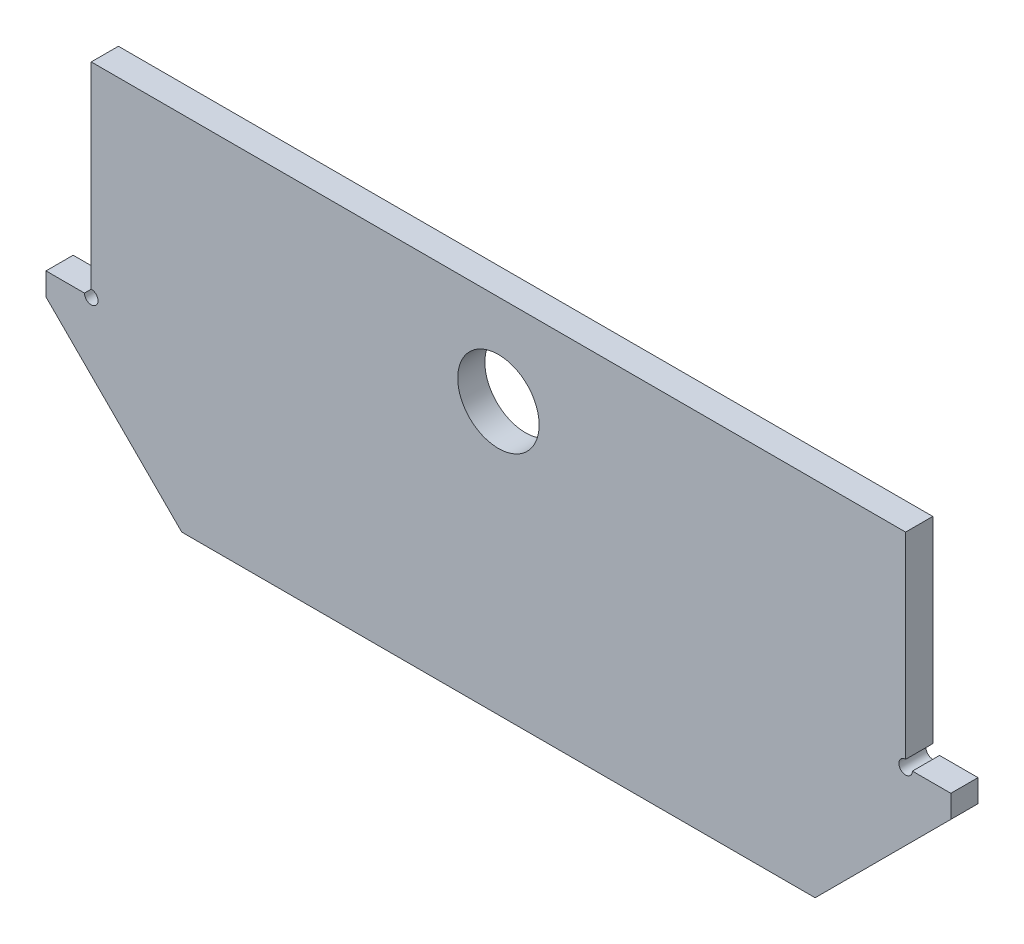
ISO-10303-21;
HEADER;
FILE_DESCRIPTION(('STEP AP214'),'2;1');
FILE_NAME('part.step','',(''),(''),'','','');
FILE_SCHEMA(('AUTOMOTIVE_DESIGN { 1 0 10303 214 1 1 1 1 }'));
ENDSEC;
DATA;
#1=APPLICATION_CONTEXT('core data for automotive mechanical design processes');
#2=APPLICATION_PROTOCOL_DEFINITION('international standard','automotive_design',2000,#1);
#3=PRODUCT_CONTEXT('',#1,'mechanical');
#4=PRODUCT('Part','Part','',(#3));
#5=PRODUCT_RELATED_PRODUCT_CATEGORY('part','',(#4));
#6=PRODUCT_DEFINITION_FORMATION('','',#4);
#7=PRODUCT_DEFINITION_CONTEXT('part definition',#1,'design');
#8=PRODUCT_DEFINITION('design','',#6,#7);
#9=PRODUCT_DEFINITION_SHAPE('','',#8);
#10=(LENGTH_UNIT() NAMED_UNIT(*) SI_UNIT(.MILLI.,.METRE.));
#11=(NAMED_UNIT(*) PLANE_ANGLE_UNIT() SI_UNIT($,.RADIAN.));
#12=(NAMED_UNIT(*) SI_UNIT($,.STERADIAN.) SOLID_ANGLE_UNIT());
#13=UNCERTAINTY_MEASURE_WITH_UNIT(LENGTH_MEASURE(1.E-05),#10,'distance_accuracy_value','');
#14=(GEOMETRIC_REPRESENTATION_CONTEXT(3) GLOBAL_UNCERTAINTY_ASSIGNED_CONTEXT((#13)) GLOBAL_UNIT_ASSIGNED_CONTEXT((#10,
#11,#12)) REPRESENTATION_CONTEXT('',''));
#15=CARTESIAN_POINT('',(0.,0.,0.));
#16=DIRECTION('',(0.,0.,1.));
#17=DIRECTION('',(1.,0.,0.));
#18=AXIS2_PLACEMENT_3D('',#15,#16,#17);
#19=CARTESIAN_POINT('',(-99.9999999999998,-1414.,-3.));
#20=DIRECTION('',(0.,1.,0.));
#21=DIRECTION('',(0.,0.,1.));
#22=AXIS2_PLACEMENT_3D('',#19,#20,#21);
#23=PLANE('',#22);
#24=DIRECTION('',(0.,0.,1.));
#25=VECTOR('',#24,1.);
#26=CARTESIAN_POINT('',(-91.4999999999998,-1414.,-3.));
#27=LINE('',#26,#25);
#28=CARTESIAN_POINT('',(-91.4999999999998,-1414.,-3.));
#29=VERTEX_POINT('',#28);
#30=CARTESIAN_POINT('',(-91.4999999999998,-1414.,3.));
#31=VERTEX_POINT('',#30);
#32=EDGE_CURVE('E58',#29,#31,#27,.T.);
#33=ORIENTED_EDGE('',*,*,#32,.F.);
#34=DIRECTION('',(-1.,0.,0.));
#35=VECTOR('',#34,1.);
#36=CARTESIAN_POINT('',(-99.9999999999998,-1414.,-3.));
#37=LINE('',#36,#35);
#38=CARTESIAN_POINT('',(-99.9999999999998,-1414.,-3.));
#39=VERTEX_POINT('',#38);
#40=EDGE_CURVE('E209',#29,#39,#37,.T.);
#41=ORIENTED_EDGE('',*,*,#40,.T.);
#42=DIRECTION('',(0.,0.,1.));
#43=VECTOR('',#42,1.);
#44=CARTESIAN_POINT('',(-99.9999999999998,-1414.,-3.));
#45=LINE('',#44,#43);
#46=CARTESIAN_POINT('',(-99.9999999999998,-1414.,3.));
#47=VERTEX_POINT('',#46);
#48=EDGE_CURVE('E167',#39,#47,#45,.T.);
#49=ORIENTED_EDGE('',*,*,#48,.T.);
#50=DIRECTION('',(-1.,0.,0.));
#51=VECTOR('',#50,1.);
#52=CARTESIAN_POINT('',(-99.9999999999998,-1414.,3.));
#53=LINE('',#52,#51);
#54=EDGE_CURVE('E195',#31,#47,#53,.T.);
#55=ORIENTED_EDGE('',*,*,#54,.F.);
#56=EDGE_LOOP('',(#33,#41,#49,#55));
#57=FACE_BOUND('',#56,.T.);
#58=ADVANCED_FACE('F36',(#57),#23,.T.);
#59=CARTESIAN_POINT('',(-90.,-1414.,-3.));
#60=DIRECTION('',(-1.,0.,0.));
#61=DIRECTION('',(0.,0.,1.));
#62=AXIS2_PLACEMENT_3D('',#59,#60,#61);
#63=PLANE('',#62);
#64=DIRECTION('',(0.,0.,1.));
#65=VECTOR('',#64,1.);
#66=CARTESIAN_POINT('',(-90.,-1412.5,-3.));
#67=LINE('',#66,#65);
#68=CARTESIAN_POINT('',(-90.,-1412.5,3.));
#69=VERTEX_POINT('',#68);
#70=CARTESIAN_POINT('',(-90.,-1412.5,-3.));
#71=VERTEX_POINT('',#70);
#72=EDGE_CURVE('E259',#69,#71,#67,.F.);
#73=ORIENTED_EDGE('',*,*,#72,.F.);
#74=DIRECTION('',(0.,-1.,0.));
#75=VECTOR('',#74,1.);
#76=CARTESIAN_POINT('',(-90.,-1414.,3.));
#77=LINE('',#76,#75);
#78=CARTESIAN_POINT('',(-90.,-1369.,3.));
#79=VERTEX_POINT('',#78);
#80=EDGE_CURVE('E207',#79,#69,#77,.T.);
#81=ORIENTED_EDGE('',*,*,#80,.F.);
#82=DIRECTION('',(0.,0.,1.));
#83=VECTOR('',#82,1.);
#84=CARTESIAN_POINT('',(-90.,-1369.,-3.));
#85=LINE('',#84,#83);
#86=CARTESIAN_POINT('',(-90.,-1369.,-3.));
#87=VERTEX_POINT('',#86);
#88=EDGE_CURVE('E168',#87,#79,#85,.T.);
#89=ORIENTED_EDGE('',*,*,#88,.F.);
#90=DIRECTION('',(0.,-1.,0.));
#91=VECTOR('',#90,1.);
#92=CARTESIAN_POINT('',(-90.,-1414.,-3.));
#93=LINE('',#92,#91);
#94=EDGE_CURVE('E163',#87,#71,#93,.T.);
#95=ORIENTED_EDGE('',*,*,#94,.T.);
#96=EDGE_LOOP('',(#73,#81,#89,#95));
#97=FACE_BOUND('',#96,.T.);
#98=ADVANCED_FACE('F268',(#97),#63,.T.);
#99=CARTESIAN_POINT('',(-90.,-1369.,-3.));
#100=DIRECTION('',(0.,1.,0.));
#101=DIRECTION('',(0.,0.,1.));
#102=AXIS2_PLACEMENT_3D('',#99,#100,#101);
#103=PLANE('',#102);
#104=ORIENTED_EDGE('',*,*,#88,.T.);
#105=DIRECTION('',(-1.,0.,0.));
#106=VECTOR('',#105,1.);
#107=CARTESIAN_POINT('',(-90.,-1369.,3.));
#108=LINE('',#107,#106);
#109=CARTESIAN_POINT('',(90.0000000000003,-1369.,3.));
#110=VERTEX_POINT('',#109);
#111=EDGE_CURVE('E210',#110,#79,#108,.T.);
#112=ORIENTED_EDGE('',*,*,#111,.F.);
#113=DIRECTION('',(0.,0.,1.));
#114=VECTOR('',#113,1.);
#115=CARTESIAN_POINT('',(90.0000000000003,-1369.,-3.));
#116=LINE('',#115,#114);
#117=CARTESIAN_POINT('',(90.0000000000003,-1369.,-3.));
#118=VERTEX_POINT('',#117);
#119=EDGE_CURVE('E171',#118,#110,#116,.T.);
#120=ORIENTED_EDGE('',*,*,#119,.F.);
#121=DIRECTION('',(-1.,0.,0.));
#122=VECTOR('',#121,1.);
#123=CARTESIAN_POINT('',(-90.,-1369.,-3.));
#124=LINE('',#123,#122);
#125=EDGE_CURVE('E153',#118,#87,#124,.T.);
#126=ORIENTED_EDGE('',*,*,#125,.T.);
#127=EDGE_LOOP('',(#104,#112,#120,#126));
#128=FACE_BOUND('',#127,.T.);
#129=ADVANCED_FACE('F273',(#128),#103,.T.);
#130=CARTESIAN_POINT('',(90.0000000000003,-1414.,-3.));
#131=DIRECTION('',(1.,0.,0.));
#132=DIRECTION('',(0.,0.,-1.));
#133=AXIS2_PLACEMENT_3D('',#130,#131,#132);
#134=PLANE('',#133);
#135=DIRECTION('',(0.,0.,1.));
#136=VECTOR('',#135,1.);
#137=CARTESIAN_POINT('',(90.0000000000003,-1412.5,-3.));
#138=LINE('',#137,#136);
#139=CARTESIAN_POINT('',(90.0000000000003,-1412.5,-3.));
#140=VERTEX_POINT('',#139);
#141=CARTESIAN_POINT('',(90.0000000000003,-1412.5,3.));
#142=VERTEX_POINT('',#141);
#143=EDGE_CURVE('E51',#140,#142,#138,.T.);
#144=ORIENTED_EDGE('',*,*,#143,.F.);
#145=DIRECTION('',(0.,1.,0.));
#146=VECTOR('',#145,1.);
#147=CARTESIAN_POINT('',(90.0000000000003,-1414.,-3.));
#148=LINE('',#147,#146);
#149=EDGE_CURVE('E142',#140,#118,#148,.T.);
#150=ORIENTED_EDGE('',*,*,#149,.T.);
#151=ORIENTED_EDGE('',*,*,#119,.T.);
#152=DIRECTION('',(0.,1.,0.));
#153=VECTOR('',#152,1.);
#154=CARTESIAN_POINT('',(90.0000000000003,-1414.,3.));
#155=LINE('',#154,#153);
#156=EDGE_CURVE('E200',#142,#110,#155,.T.);
#157=ORIENTED_EDGE('',*,*,#156,.F.);
#158=EDGE_LOOP('',(#144,#150,#151,#157));
#159=FACE_BOUND('',#158,.T.);
#160=ADVANCED_FACE('F276',(#159),#134,.T.);
#161=CARTESIAN_POINT('',(90.0000000000003,-1414.,-3.));
#162=DIRECTION('',(0.,1.,0.));
#163=DIRECTION('',(0.,0.,1.));
#164=AXIS2_PLACEMENT_3D('',#161,#162,#163);
#165=PLANE('',#164);
#166=DIRECTION('',(0.,0.,1.));
#167=VECTOR('',#166,1.);
#168=CARTESIAN_POINT('',(91.5000000000002,-1414.,-3.));
#169=LINE('',#168,#167);
#170=CARTESIAN_POINT('',(91.5000000000002,-1414.,3.));
#171=VERTEX_POINT('',#170);
#172=CARTESIAN_POINT('',(91.5000000000002,-1414.,-3.));
#173=VERTEX_POINT('',#172);
#174=EDGE_CURVE('E122',#171,#173,#169,.F.);
#175=ORIENTED_EDGE('',*,*,#174,.F.);
#176=DIRECTION('',(-1.,0.,0.));
#177=VECTOR('',#176,1.);
#178=CARTESIAN_POINT('',(90.0000000000003,-1414.,3.));
#179=LINE('',#178,#177);
#180=CARTESIAN_POINT('',(100.,-1414.,3.));
#181=VERTEX_POINT('',#180);
#182=EDGE_CURVE('E237',#181,#171,#179,.T.);
#183=ORIENTED_EDGE('',*,*,#182,.F.);
#184=DIRECTION('',(0.,0.,1.));
#185=VECTOR('',#184,1.);
#186=CARTESIAN_POINT('',(100.,-1414.,-3.));
#187=LINE('',#186,#185);
#188=CARTESIAN_POINT('',(100.,-1414.,-3.));
#189=VERTEX_POINT('',#188);
#190=EDGE_CURVE('E146',#189,#181,#187,.T.);
#191=ORIENTED_EDGE('',*,*,#190,.F.);
#192=DIRECTION('',(-1.,0.,0.));
#193=VECTOR('',#192,1.);
#194=CARTESIAN_POINT('',(90.0000000000003,-1414.,-3.));
#195=LINE('',#194,#193);
#196=EDGE_CURVE('E139',#189,#173,#195,.T.);
#197=ORIENTED_EDGE('',*,*,#196,.T.);
#198=EDGE_LOOP('',(#175,#183,#191,#197));
#199=FACE_BOUND('',#198,.T.);
#200=ADVANCED_FACE('F145',(#199),#165,.T.);
#201=CARTESIAN_POINT('',(100.,-1414.,-3.));
#202=DIRECTION('',(1.,0.,0.));
#203=DIRECTION('',(0.,0.,-1.));
#204=AXIS2_PLACEMENT_3D('',#201,#202,#203);
#205=PLANE('',#204);
#206=ORIENTED_EDGE('',*,*,#190,.T.);
#207=DIRECTION('',(0.,1.,0.));
#208=VECTOR('',#207,1.);
#209=CARTESIAN_POINT('',(100.,-1414.,3.));
#210=LINE('',#209,#208);
#211=CARTESIAN_POINT('',(100.,-1419.,3.));
#212=VERTEX_POINT('',#211);
#213=EDGE_CURVE('E239',#212,#181,#210,.T.);
#214=ORIENTED_EDGE('',*,*,#213,.F.);
#215=DIRECTION('',(0.,0.,1.));
#216=VECTOR('',#215,1.);
#217=CARTESIAN_POINT('',(100.,-1419.,-3.));
#218=LINE('',#217,#216);
#219=CARTESIAN_POINT('',(100.,-1419.,-3.));
#220=VERTEX_POINT('',#219);
#221=EDGE_CURVE('E177',#220,#212,#218,.T.);
#222=ORIENTED_EDGE('',*,*,#221,.F.);
#223=DIRECTION('',(0.,1.,0.));
#224=VECTOR('',#223,1.);
#225=CARTESIAN_POINT('',(100.,-1414.,-3.));
#226=LINE('',#225,#224);
#227=EDGE_CURVE('E148',#220,#189,#226,.T.);
#228=ORIENTED_EDGE('',*,*,#227,.T.);
#229=EDGE_LOOP('',(#206,#214,#222,#228));
#230=FACE_BOUND('',#229,.T.);
#231=ADVANCED_FACE('F283',(#230),#205,.T.);
#232=CARTESIAN_POINT('',(70.0000000000002,-1449.,-3.));
#233=DIRECTION('',(0.707106781186548,-0.707106781186547,0.));
#234=DIRECTION('',(0.707106781186547,0.707106781186548,0.));
#235=AXIS2_PLACEMENT_3D('',#232,#233,#234);
#236=PLANE('',#235);
#237=ORIENTED_EDGE('',*,*,#221,.T.);
#238=DIRECTION('',(0.707106781186547,0.707106781186548,0.));
#239=VECTOR('',#238,1.);
#240=CARTESIAN_POINT('',(70.0000000000002,-1449.,3.));
#241=LINE('',#240,#239);
#242=CARTESIAN_POINT('',(70.0000000000002,-1449.,3.));
#243=VERTEX_POINT('',#242);
#244=EDGE_CURVE('E243',#243,#212,#241,.T.);
#245=ORIENTED_EDGE('',*,*,#244,.F.);
#246=DIRECTION('',(0.,0.,1.));
#247=VECTOR('',#246,1.);
#248=CARTESIAN_POINT('',(70.0000000000002,-1449.,-3.));
#249=LINE('',#248,#247);
#250=CARTESIAN_POINT('',(70.0000000000002,-1449.,-3.));
#251=VERTEX_POINT('',#250);
#252=EDGE_CURVE('E180',#251,#243,#249,.T.);
#253=ORIENTED_EDGE('',*,*,#252,.F.);
#254=DIRECTION('',(0.707106781186547,0.707106781186548,0.));
#255=VECTOR('',#254,1.);
#256=CARTESIAN_POINT('',(70.0000000000002,-1449.,-3.));
#257=LINE('',#256,#255);
#258=EDGE_CURVE('E156',#251,#220,#257,.T.);
#259=ORIENTED_EDGE('',*,*,#258,.T.);
#260=EDGE_LOOP('',(#237,#245,#253,#259));
#261=FACE_BOUND('',#260,.T.);
#262=ADVANCED_FACE('F286',(#261),#236,.T.);
#263=CARTESIAN_POINT('',(-69.9999999999998,-1449.,-3.));
#264=DIRECTION('',(0.,-1.,0.));
#265=DIRECTION('',(0.,0.,-1.));
#266=AXIS2_PLACEMENT_3D('',#263,#264,#265);
#267=PLANE('',#266);
#268=ORIENTED_EDGE('',*,*,#252,.T.);
#269=DIRECTION('',(1.,0.,0.));
#270=VECTOR('',#269,1.);
#271=CARTESIAN_POINT('',(-69.9999999999998,-1449.,3.));
#272=LINE('',#271,#270);
#273=CARTESIAN_POINT('',(-69.9999999999998,-1449.,3.));
#274=VERTEX_POINT('',#273);
#275=EDGE_CURVE('E247',#274,#243,#272,.T.);
#276=ORIENTED_EDGE('',*,*,#275,.F.);
#277=DIRECTION('',(0.,0.,1.));
#278=VECTOR('',#277,1.);
#279=CARTESIAN_POINT('',(-69.9999999999998,-1449.,-3.));
#280=LINE('',#279,#278);
#281=CARTESIAN_POINT('',(-69.9999999999998,-1449.,-3.));
#282=VERTEX_POINT('',#281);
#283=EDGE_CURVE('E183',#282,#274,#280,.T.);
#284=ORIENTED_EDGE('',*,*,#283,.F.);
#285=DIRECTION('',(1.,0.,0.));
#286=VECTOR('',#285,1.);
#287=CARTESIAN_POINT('',(-69.9999999999998,-1449.,-3.));
#288=LINE('',#287,#286);
#289=EDGE_CURVE('E215',#282,#251,#288,.T.);
#290=ORIENTED_EDGE('',*,*,#289,.T.);
#291=EDGE_LOOP('',(#268,#276,#284,#290));
#292=FACE_BOUND('',#291,.T.);
#293=ADVANCED_FACE('F288',(#292),#267,.T.);
#294=CARTESIAN_POINT('',(-99.9999999999998,-1419.,-3.));
#295=DIRECTION('',(-0.707106781186548,-0.707106781186547,0.));
#296=DIRECTION('',(0.707106781186547,-0.707106781186548,0.));
#297=AXIS2_PLACEMENT_3D('',#294,#295,#296);
#298=PLANE('',#297);
#299=ORIENTED_EDGE('',*,*,#283,.T.);
#300=DIRECTION('',(0.707106781186547,-0.707106781186548,0.));
#301=VECTOR('',#300,1.);
#302=CARTESIAN_POINT('',(-99.9999999999998,-1419.,3.));
#303=LINE('',#302,#301);
#304=CARTESIAN_POINT('',(-99.9999999999998,-1419.,3.));
#305=VERTEX_POINT('',#304);
#306=EDGE_CURVE('E204',#305,#274,#303,.T.);
#307=ORIENTED_EDGE('',*,*,#306,.F.);
#308=DIRECTION('',(0.,0.,1.));
#309=VECTOR('',#308,1.);
#310=CARTESIAN_POINT('',(-99.9999999999998,-1419.,-3.));
#311=LINE('',#310,#309);
#312=CARTESIAN_POINT('',(-99.9999999999998,-1419.,-3.));
#313=VERTEX_POINT('',#312);
#314=EDGE_CURVE('E186',#313,#305,#311,.T.);
#315=ORIENTED_EDGE('',*,*,#314,.F.);
#316=DIRECTION('',(0.707106781186547,-0.707106781186548,0.));
#317=VECTOR('',#316,1.);
#318=CARTESIAN_POINT('',(-99.9999999999998,-1419.,-3.));
#319=LINE('',#318,#317);
#320=EDGE_CURVE('E217',#313,#282,#319,.T.);
#321=ORIENTED_EDGE('',*,*,#320,.T.);
#322=EDGE_LOOP('',(#299,#307,#315,#321));
#323=FACE_BOUND('',#322,.T.);
#324=ADVANCED_FACE('F292',(#323),#298,.T.);
#325=CARTESIAN_POINT('',(-99.9999999999998,-1414.,-3.));
#326=DIRECTION('',(-1.,0.,0.));
#327=DIRECTION('',(0.,0.,1.));
#328=AXIS2_PLACEMENT_3D('',#325,#326,#327);
#329=PLANE('',#328);
#330=ORIENTED_EDGE('',*,*,#314,.T.);
#331=DIRECTION('',(0.,-1.,0.));
#332=VECTOR('',#331,1.);
#333=CARTESIAN_POINT('',(-99.9999999999998,-1414.,3.));
#334=LINE('',#333,#332);
#335=EDGE_CURVE('E202',#47,#305,#334,.T.);
#336=ORIENTED_EDGE('',*,*,#335,.F.);
#337=ORIENTED_EDGE('',*,*,#48,.F.);
#338=DIRECTION('',(0.,-1.,0.));
#339=VECTOR('',#338,1.);
#340=CARTESIAN_POINT('',(-99.9999999999998,-1414.,-3.));
#341=LINE('',#340,#339);
#342=EDGE_CURVE('E225',#39,#313,#341,.T.);
#343=ORIENTED_EDGE('',*,*,#342,.T.);
#344=EDGE_LOOP('',(#330,#336,#337,#343));
#345=FACE_BOUND('',#344,.T.);
#346=ADVANCED_FACE('F296',(#345),#329,.T.);
#347=CARTESIAN_POINT('',(0.,0.,-3.));
#348=DIRECTION('',(0.,0.,1.));
#349=DIRECTION('',(1.,0.,0.));
#350=AXIS2_PLACEMENT_3D('',#347,#348,#349);
#351=PLANE('',#350);
#352=CARTESIAN_POINT('',(7.45777626196619E-13,-1389.,-3.));
#353=DIRECTION('',(0.,0.,1.));
#354=DIRECTION('',(1.,0.,0.));
#355=AXIS2_PLACEMENT_3D('',#352,#353,#354);
#356=CIRCLE('',#355,9.00000000000002);
#357=CARTESIAN_POINT('',(9.00000000000077,-1389.,-3.));
#358=VERTEX_POINT('',#357);
#359=EDGE_CURVE('E196',#358,#358,#356,.T.);
#360=ORIENTED_EDGE('',*,*,#359,.T.);
#361=EDGE_LOOP('',(#360));
#362=FACE_BOUND('',#361,.T.);
#363=ORIENTED_EDGE('',*,*,#40,.F.);
#364=CARTESIAN_POINT('',(-90.,-1414.,-3.));
#365=DIRECTION('',(0.,0.,1.));
#366=DIRECTION('',(1.,0.,0.));
#367=AXIS2_PLACEMENT_3D('',#364,#365,#366);
#368=CIRCLE('',#367,1.49999999999985);
#369=EDGE_CURVE('E131',#29,#71,#368,.T.);
#370=ORIENTED_EDGE('',*,*,#369,.T.);
#371=ORIENTED_EDGE('',*,*,#94,.F.);
#372=ORIENTED_EDGE('',*,*,#125,.F.);
#373=ORIENTED_EDGE('',*,*,#149,.F.);
#374=CARTESIAN_POINT('',(90.0000000000003,-1414.,-3.));
#375=DIRECTION('',(0.,0.,1.));
#376=DIRECTION('',(1.,0.,0.));
#377=AXIS2_PLACEMENT_3D('',#374,#375,#376);
#378=CIRCLE('',#377,1.49999999999985);
#379=EDGE_CURVE('E125',#140,#173,#378,.T.);
#380=ORIENTED_EDGE('',*,*,#379,.T.);
#381=ORIENTED_EDGE('',*,*,#196,.F.);
#382=ORIENTED_EDGE('',*,*,#227,.F.);
#383=ORIENTED_EDGE('',*,*,#258,.F.);
#384=ORIENTED_EDGE('',*,*,#289,.F.);
#385=ORIENTED_EDGE('',*,*,#320,.F.);
#386=ORIENTED_EDGE('',*,*,#342,.F.);
#387=EDGE_LOOP('',(#363,#370,#371,#372,#373,#380,#381,#382,#383,#384,#385,#386));
#388=FACE_BOUND('',#387,.T.);
#389=ADVANCED_FACE('F137',(#362,#388),#351,.F.);
#390=CARTESIAN_POINT('',(0.,0.,3.));
#391=DIRECTION('',(0.,0.,1.));
#392=DIRECTION('',(1.,0.,0.));
#393=AXIS2_PLACEMENT_3D('',#390,#391,#392);
#394=PLANE('',#393);
#395=CARTESIAN_POINT('',(-90.,-1414.,3.));
#396=DIRECTION('',(0.,0.,1.));
#397=DIRECTION('',(1.,0.,0.));
#398=AXIS2_PLACEMENT_3D('',#395,#396,#397);
#399=CIRCLE('',#398,1.49999999999985);
#400=EDGE_CURVE('E11',#31,#69,#399,.T.);
#401=ORIENTED_EDGE('',*,*,#400,.F.);
#402=ORIENTED_EDGE('',*,*,#54,.T.);
#403=ORIENTED_EDGE('',*,*,#335,.T.);
#404=ORIENTED_EDGE('',*,*,#306,.T.);
#405=ORIENTED_EDGE('',*,*,#275,.T.);
#406=ORIENTED_EDGE('',*,*,#244,.T.);
#407=ORIENTED_EDGE('',*,*,#213,.T.);
#408=ORIENTED_EDGE('',*,*,#182,.T.);
#409=CARTESIAN_POINT('',(90.0000000000003,-1414.,3.));
#410=DIRECTION('',(0.,0.,1.));
#411=DIRECTION('',(1.,0.,0.));
#412=AXIS2_PLACEMENT_3D('',#409,#410,#411);
#413=CIRCLE('',#412,1.49999999999985);
#414=EDGE_CURVE('E44',#142,#171,#413,.T.);
#415=ORIENTED_EDGE('',*,*,#414,.F.);
#416=ORIENTED_EDGE('',*,*,#156,.T.);
#417=ORIENTED_EDGE('',*,*,#111,.T.);
#418=ORIENTED_EDGE('',*,*,#80,.T.);
#419=EDGE_LOOP('',(#401,#402,#403,#404,#405,#406,#407,#408,#415,#416,#417,#418));
#420=FACE_BOUND('',#419,.T.);
#421=CARTESIAN_POINT('',(7.45777626196619E-13,-1389.,3.));
#422=DIRECTION('',(0.,0.,1.));
#423=DIRECTION('',(1.,0.,0.));
#424=AXIS2_PLACEMENT_3D('',#421,#422,#423);
#425=CIRCLE('',#424,9.00000000000002);
#426=CARTESIAN_POINT('',(9.00000000000077,-1389.,3.));
#427=VERTEX_POINT('',#426);
#428=EDGE_CURVE('E192',#427,#427,#425,.T.);
#429=ORIENTED_EDGE('',*,*,#428,.F.);
#430=EDGE_LOOP('',(#429));
#431=FACE_BOUND('',#430,.T.);
#432=ADVANCED_FACE('F278',(#420,#431),#394,.T.);
#433=CARTESIAN_POINT('',(7.45777626196619E-13,-1389.,-3.));
#434=DIRECTION('',(0.,0.,1.));
#435=DIRECTION('',(1.,0.,0.));
#436=AXIS2_PLACEMENT_3D('',#433,#434,#435);
#437=CYLINDRICAL_SURFACE('',#436,9.00000000000002);
#438=ORIENTED_EDGE('',*,*,#428,.T.);
#439=EDGE_LOOP('',(#438));
#440=FACE_BOUND('',#439,.T.);
#441=ORIENTED_EDGE('',*,*,#359,.F.);
#442=EDGE_LOOP('',(#441));
#443=FACE_BOUND('',#442,.T.);
#444=ADVANCED_FACE('F305',(#440,#443),#437,.F.);
#445=CARTESIAN_POINT('',(90.0000000000003,-1414.,-3.));
#446=DIRECTION('',(0.,0.,1.));
#447=DIRECTION('',(1.,0.,0.));
#448=AXIS2_PLACEMENT_3D('',#445,#446,#447);
#449=CYLINDRICAL_SURFACE('',#448,1.49999999999985);
#450=ORIENTED_EDGE('',*,*,#143,.T.);
#451=ORIENTED_EDGE('',*,*,#414,.T.);
#452=ORIENTED_EDGE('',*,*,#174,.T.);
#453=ORIENTED_EDGE('',*,*,#379,.F.);
#454=EDGE_LOOP('',(#450,#451,#452,#453));
#455=FACE_BOUND('',#454,.T.);
#456=ADVANCED_FACE('F124',(#455),#449,.F.);
#457=CARTESIAN_POINT('',(-90.,-1414.,-3.));
#458=DIRECTION('',(0.,0.,1.));
#459=DIRECTION('',(1.,0.,0.));
#460=AXIS2_PLACEMENT_3D('',#457,#458,#459);
#461=CYLINDRICAL_SURFACE('',#460,1.49999999999985);
#462=ORIENTED_EDGE('',*,*,#32,.T.);
#463=ORIENTED_EDGE('',*,*,#400,.T.);
#464=ORIENTED_EDGE('',*,*,#72,.T.);
#465=ORIENTED_EDGE('',*,*,#369,.F.);
#466=EDGE_LOOP('',(#462,#463,#464,#465));
#467=FACE_BOUND('',#466,.T.);
#468=ADVANCED_FACE('F299',(#467),#461,.F.);
#469=CLOSED_SHELL('',(#58,#98,#129,#160,#200,#231,#262,#293,#324,#346,#389,#432,#444,#456,#468));
#470=MANIFOLD_SOLID_BREP('B2',#469);
#471=ADVANCED_BREP_SHAPE_REPRESENTATION('',(#18,#470),#14);
#472=SHAPE_DEFINITION_REPRESENTATION(#9,#471);
ENDSEC;
END-ISO-10303-21;
